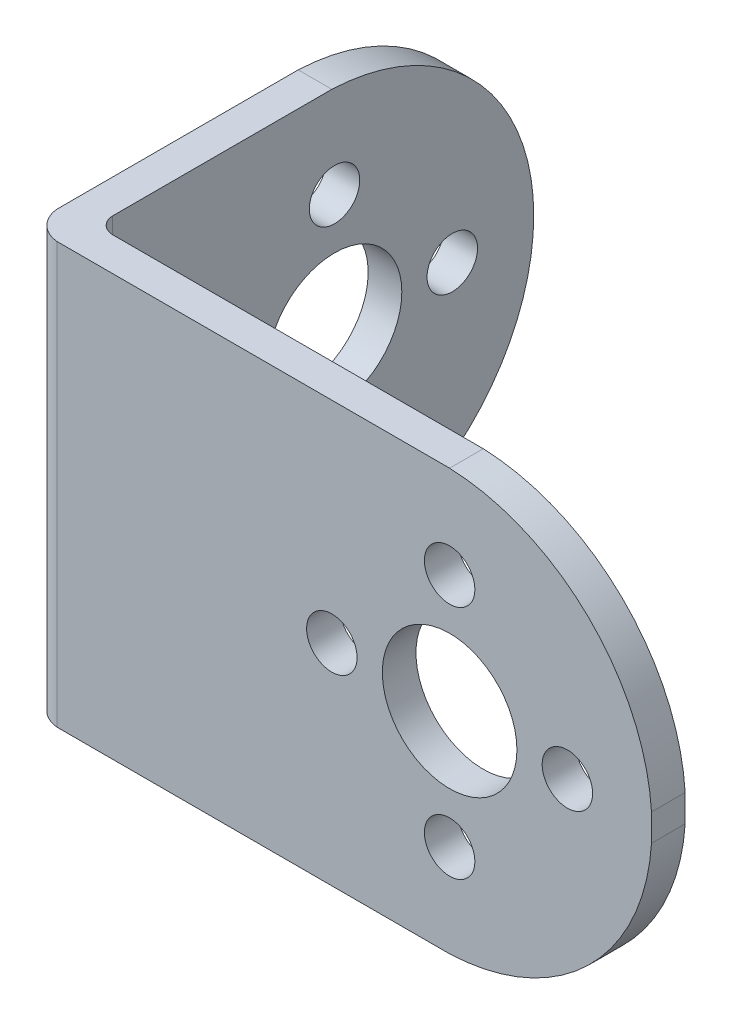
ISO-10303-21;
HEADER;
FILE_DESCRIPTION(('STEP AP214'),'2;1');
FILE_NAME('part.step','',(''),(''),'','','');
FILE_SCHEMA(('AUTOMOTIVE_DESIGN { 1 0 10303 214 1 1 1 1 }'));
ENDSEC;
DATA;
#1=APPLICATION_CONTEXT('core data for automotive mechanical design processes');
#2=APPLICATION_PROTOCOL_DEFINITION('international standard','automotive_design',2000,#1);
#3=PRODUCT_CONTEXT('',#1,'mechanical');
#4=PRODUCT('Part','Part','',(#3));
#5=PRODUCT_RELATED_PRODUCT_CATEGORY('part','',(#4));
#6=PRODUCT_DEFINITION_FORMATION('','',#4);
#7=PRODUCT_DEFINITION_CONTEXT('part definition',#1,'design');
#8=PRODUCT_DEFINITION('design','',#6,#7);
#9=PRODUCT_DEFINITION_SHAPE('','',#8);
#10=(LENGTH_UNIT() NAMED_UNIT(*) SI_UNIT(.MILLI.,.METRE.));
#11=(NAMED_UNIT(*) PLANE_ANGLE_UNIT() SI_UNIT($,.RADIAN.));
#12=(NAMED_UNIT(*) SI_UNIT($,.STERADIAN.) SOLID_ANGLE_UNIT());
#13=UNCERTAINTY_MEASURE_WITH_UNIT(LENGTH_MEASURE(1.E-05),#10,'distance_accuracy_value','');
#14=(GEOMETRIC_REPRESENTATION_CONTEXT(3) GLOBAL_UNCERTAINTY_ASSIGNED_CONTEXT((#13)) GLOBAL_UNIT_ASSIGNED_CONTEXT((#10,
#11,#12)) REPRESENTATION_CONTEXT('',''));
#15=CARTESIAN_POINT('',(0.,0.,0.));
#16=DIRECTION('',(0.,0.,1.));
#17=DIRECTION('',(1.,0.,0.));
#18=AXIS2_PLACEMENT_3D('',#15,#16,#17);
#19=CARTESIAN_POINT('',(0.,25.,0.));
#20=DIRECTION('',(0.,0.,-1.));
#21=DIRECTION('',(-1.,0.,0.));
#22=AXIS2_PLACEMENT_3D('',#19,#20,#21);
#23=PLANE('',#22);
#24=CARTESIAN_POINT('',(25.,19.5,0.));
#25=DIRECTION('',(0.,0.,1.));
#26=DIRECTION('',(1.,0.,0.));
#27=AXIS2_PLACEMENT_3D('',#24,#25,#26);
#28=CIRCLE('',#27,1.5);
#29=CARTESIAN_POINT('',(26.5,19.5,0.));
#30=VERTEX_POINT('',#29);
#31=EDGE_CURVE('E356',#30,#30,#28,.T.);
#32=ORIENTED_EDGE('',*,*,#31,.F.);
#33=EDGE_LOOP('',(#32));
#34=FACE_BOUND('',#33,.T.);
#35=CARTESIAN_POINT('',(32.0000000000001,12.5000000000001,0.));
#36=DIRECTION('',(0.,0.,1.));
#37=DIRECTION('',(1.,0.,0.));
#38=AXIS2_PLACEMENT_3D('',#35,#36,#37);
#39=CIRCLE('',#38,1.5);
#40=CARTESIAN_POINT('',(33.5000000000001,12.5000000000001,0.));
#41=VERTEX_POINT('',#40);
#42=EDGE_CURVE('E352',#41,#41,#39,.T.);
#43=ORIENTED_EDGE('',*,*,#42,.F.);
#44=EDGE_LOOP('',(#43));
#45=FACE_BOUND('',#44,.T.);
#46=CARTESIAN_POINT('',(25.0000000000002,5.5,0.));
#47=DIRECTION('',(0.,0.,1.));
#48=DIRECTION('',(1.,0.,0.));
#49=AXIS2_PLACEMENT_3D('',#46,#47,#48);
#50=CIRCLE('',#49,1.5);
#51=CARTESIAN_POINT('',(26.5000000000002,5.5,0.));
#52=VERTEX_POINT('',#51);
#53=EDGE_CURVE('E348',#52,#52,#50,.T.);
#54=ORIENTED_EDGE('',*,*,#53,.F.);
#55=EDGE_LOOP('',(#54));
#56=FACE_BOUND('',#55,.T.);
#57=CARTESIAN_POINT('',(18.0000000000001,12.5,0.));
#58=DIRECTION('',(0.,0.,1.));
#59=DIRECTION('',(1.,0.,0.));
#60=AXIS2_PLACEMENT_3D('',#57,#58,#59);
#61=CIRCLE('',#60,1.5);
#62=CARTESIAN_POINT('',(19.5000000000001,12.5,0.));
#63=VERTEX_POINT('',#62);
#64=EDGE_CURVE('E347',#63,#63,#61,.T.);
#65=ORIENTED_EDGE('',*,*,#64,.F.);
#66=EDGE_LOOP('',(#65));
#67=FACE_BOUND('',#66,.T.);
#68=CARTESIAN_POINT('',(25.,12.5,0.));
#69=DIRECTION('',(0.,0.,1.));
#70=DIRECTION('',(1.,0.,0.));
#71=AXIS2_PLACEMENT_3D('',#68,#69,#70);
#72=CIRCLE('',#71,4.);
#73=CARTESIAN_POINT('',(29.,12.5,0.));
#74=VERTEX_POINT('',#73);
#75=EDGE_CURVE('E176',#74,#74,#72,.T.);
#76=ORIENTED_EDGE('',*,*,#75,.F.);
#77=EDGE_LOOP('',(#76));
#78=FACE_BOUND('',#77,.T.);
#79=CARTESIAN_POINT('',(24.5166193979498,12.5,0.));
#80=DIRECTION('',(0.,0.,1.));
#81=DIRECTION('',(1.,0.,0.));
#82=AXIS2_PLACEMENT_3D('',#79,#80,#81);
#83=CIRCLE('',#82,12.5093427807554);
#84=CARTESIAN_POINT('',(37.,13.3055219120512,0.));
#85=VERTEX_POINT('',#84);
#86=CARTESIAN_POINT('',(25.,25.,0.));
#87=VERTEX_POINT('',#86);
#88=EDGE_CURVE('E121',#85,#87,#83,.T.);
#89=ORIENTED_EDGE('',*,*,#88,.T.);
#90=DIRECTION('',(1.,0.,0.));
#91=VECTOR('',#90,1.);
#92=CARTESIAN_POINT('',(0.,25.,0.));
#93=LINE('',#92,#91);
#94=CARTESIAN_POINT('',(1.65907540690337,25.,0.));
#95=VERTEX_POINT('',#94);
#96=EDGE_CURVE('E223',#95,#87,#93,.T.);
#97=ORIENTED_EDGE('',*,*,#96,.F.);
#98=DIRECTION('',(0.,-1.,0.));
#99=VECTOR('',#98,1.);
#100=CARTESIAN_POINT('',(1.65907540690337,25.,0.));
#101=LINE('',#100,#99);
#102=CARTESIAN_POINT('',(1.65907540690337,0.,0.));
#103=VERTEX_POINT('',#102);
#104=EDGE_CURVE('E145',#95,#103,#101,.T.);
#105=ORIENTED_EDGE('',*,*,#104,.T.);
#106=DIRECTION('',(1.,0.,0.));
#107=VECTOR('',#106,1.);
#108=CARTESIAN_POINT('',(0.,0.,0.));
#109=LINE('',#108,#107);
#110=CARTESIAN_POINT('',(25.,0.,0.));
#111=VERTEX_POINT('',#110);
#112=EDGE_CURVE('E242',#103,#111,#109,.T.);
#113=ORIENTED_EDGE('',*,*,#112,.T.);
#114=CARTESIAN_POINT('',(24.5166193979498,12.5,0.));
#115=DIRECTION('',(0.,0.,1.));
#116=DIRECTION('',(1.,0.,0.));
#117=AXIS2_PLACEMENT_3D('',#114,#115,#116);
#118=CIRCLE('',#117,12.5093427807554);
#119=CARTESIAN_POINT('',(37.,11.6944780879488,0.));
#120=VERTEX_POINT('',#119);
#121=EDGE_CURVE('E69',#111,#120,#118,.T.);
#122=ORIENTED_EDGE('',*,*,#121,.T.);
#123=DIRECTION('',(0.,-1.,0.));
#124=VECTOR('',#123,1.);
#125=CARTESIAN_POINT('',(37.,25.,0.));
#126=LINE('',#125,#124);
#127=EDGE_CURVE('E137',#85,#120,#126,.T.);
#128=ORIENTED_EDGE('',*,*,#127,.F.);
#129=EDGE_LOOP('',(#89,#97,#105,#113,#122,#128));
#130=FACE_BOUND('',#129,.T.);
#131=ADVANCED_FACE('F44',(#34,#45,#56,#67,#78,#130),#23,.F.);
#132=CARTESIAN_POINT('',(37.,25.,0.));
#133=DIRECTION('',(-1.,0.,0.));
#134=DIRECTION('',(0.,0.,1.));
#135=AXIS2_PLACEMENT_3D('',#132,#133,#134);
#136=PLANE('',#135);
#137=DIRECTION('',(0.,0.,1.));
#138=VECTOR('',#137,1.);
#139=CARTESIAN_POINT('',(37.,13.3055219120512,-25.));
#140=LINE('',#139,#138);
#141=CARTESIAN_POINT('',(37.,13.3055219120512,-2.));
#142=VERTEX_POINT('',#141);
#143=EDGE_CURVE('E124',#142,#85,#140,.T.);
#144=ORIENTED_EDGE('',*,*,#143,.T.);
#145=ORIENTED_EDGE('',*,*,#127,.T.);
#146=DIRECTION('',(0.,0.,1.));
#147=VECTOR('',#146,1.);
#148=CARTESIAN_POINT('',(37.,11.6944780879488,-25.));
#149=LINE('',#148,#147);
#150=CARTESIAN_POINT('',(37.,11.6944780879488,-2.));
#151=VERTEX_POINT('',#150);
#152=EDGE_CURVE('E130',#151,#120,#149,.T.);
#153=ORIENTED_EDGE('',*,*,#152,.F.);
#154=DIRECTION('',(0.,-1.,0.));
#155=VECTOR('',#154,1.);
#156=CARTESIAN_POINT('',(37.,25.,-2.));
#157=LINE('',#156,#155);
#158=EDGE_CURVE('E139',#142,#151,#157,.T.);
#159=ORIENTED_EDGE('',*,*,#158,.F.);
#160=EDGE_LOOP('',(#144,#145,#153,#159));
#161=FACE_BOUND('',#160,.T.);
#162=ADVANCED_FACE('F135',(#161),#136,.F.);
#163=CARTESIAN_POINT('',(0.,25.,-2.));
#164=DIRECTION('',(0.,0.,1.));
#165=DIRECTION('',(1.,0.,0.));
#166=AXIS2_PLACEMENT_3D('',#163,#164,#165);
#167=PLANE('',#166);
#168=CARTESIAN_POINT('',(25.,19.5,-2.));
#169=DIRECTION('',(0.,0.,1.));
#170=DIRECTION('',(1.,0.,0.));
#171=AXIS2_PLACEMENT_3D('',#168,#169,#170);
#172=CIRCLE('',#171,1.5);
#173=CARTESIAN_POINT('',(26.5,19.5,-2.));
#174=VERTEX_POINT('',#173);
#175=EDGE_CURVE('E48',#174,#174,#172,.T.);
#176=ORIENTED_EDGE('',*,*,#175,.T.);
#177=EDGE_LOOP('',(#176));
#178=FACE_BOUND('',#177,.T.);
#179=CARTESIAN_POINT('',(32.0000000000001,12.5000000000001,-2.));
#180=DIRECTION('',(0.,0.,1.));
#181=DIRECTION('',(1.,0.,0.));
#182=AXIS2_PLACEMENT_3D('',#179,#180,#181);
#183=CIRCLE('',#182,1.5);
#184=CARTESIAN_POINT('',(33.5000000000001,12.5000000000001,-2.));
#185=VERTEX_POINT('',#184);
#186=EDGE_CURVE('E183',#185,#185,#183,.T.);
#187=ORIENTED_EDGE('',*,*,#186,.T.);
#188=EDGE_LOOP('',(#187));
#189=FACE_BOUND('',#188,.T.);
#190=CARTESIAN_POINT('',(25.0000000000002,5.5,-2.));
#191=DIRECTION('',(0.,0.,1.));
#192=DIRECTION('',(1.,0.,0.));
#193=AXIS2_PLACEMENT_3D('',#190,#191,#192);
#194=CIRCLE('',#193,1.5);
#195=CARTESIAN_POINT('',(26.5000000000002,5.5,-2.));
#196=VERTEX_POINT('',#195);
#197=EDGE_CURVE('E180',#196,#196,#194,.T.);
#198=ORIENTED_EDGE('',*,*,#197,.T.);
#199=EDGE_LOOP('',(#198));
#200=FACE_BOUND('',#199,.T.);
#201=CARTESIAN_POINT('',(18.0000000000001,12.5,-2.));
#202=DIRECTION('',(0.,0.,1.));
#203=DIRECTION('',(1.,0.,0.));
#204=AXIS2_PLACEMENT_3D('',#201,#202,#203);
#205=CIRCLE('',#204,1.5);
#206=CARTESIAN_POINT('',(19.5000000000001,12.5,-2.));
#207=VERTEX_POINT('',#206);
#208=EDGE_CURVE('E175',#207,#207,#205,.T.);
#209=ORIENTED_EDGE('',*,*,#208,.T.);
#210=EDGE_LOOP('',(#209));
#211=FACE_BOUND('',#210,.T.);
#212=CARTESIAN_POINT('',(25.,12.5,-2.));
#213=DIRECTION('',(0.,0.,1.));
#214=DIRECTION('',(1.,0.,0.));
#215=AXIS2_PLACEMENT_3D('',#212,#213,#214);
#216=CIRCLE('',#215,4.);
#217=CARTESIAN_POINT('',(29.,12.5,-2.));
#218=VERTEX_POINT('',#217);
#219=EDGE_CURVE('E171',#218,#218,#216,.T.);
#220=ORIENTED_EDGE('',*,*,#219,.T.);
#221=EDGE_LOOP('',(#220));
#222=FACE_BOUND('',#221,.T.);
#223=CARTESIAN_POINT('',(24.5166193979498,12.5,-2.));
#224=DIRECTION('',(0.,0.,1.));
#225=DIRECTION('',(1.,0.,0.));
#226=AXIS2_PLACEMENT_3D('',#223,#224,#225);
#227=CIRCLE('',#226,12.5093427807554);
#228=CARTESIAN_POINT('',(25.,25.,-2.));
#229=VERTEX_POINT('',#228);
#230=EDGE_CURVE('E62',#142,#229,#227,.T.);
#231=ORIENTED_EDGE('',*,*,#230,.F.);
#232=ORIENTED_EDGE('',*,*,#158,.T.);
#233=CARTESIAN_POINT('',(24.5166193979498,12.5,-2.));
#234=DIRECTION('',(0.,0.,1.));
#235=DIRECTION('',(1.,0.,0.));
#236=AXIS2_PLACEMENT_3D('',#233,#234,#235);
#237=CIRCLE('',#236,12.5093427807554);
#238=CARTESIAN_POINT('',(25.,0.,-2.));
#239=VERTEX_POINT('',#238);
#240=EDGE_CURVE('E141',#239,#151,#237,.T.);
#241=ORIENTED_EDGE('',*,*,#240,.F.);
#242=DIRECTION('',(-1.,0.,0.));
#243=VECTOR('',#242,1.);
#244=CARTESIAN_POINT('',(0.,0.,-2.));
#245=LINE('',#244,#243);
#246=CARTESIAN_POINT('',(3.03872971417256,0.,-2.));
#247=VERTEX_POINT('',#246);
#248=EDGE_CURVE('E213',#239,#247,#245,.T.);
#249=ORIENTED_EDGE('',*,*,#248,.T.);
#250=DIRECTION('',(0.,-1.,0.));
#251=VECTOR('',#250,1.);
#252=CARTESIAN_POINT('',(3.03872971417256,25.,-2.));
#253=LINE('',#252,#251);
#254=CARTESIAN_POINT('',(3.03872971417256,25.,-2.));
#255=VERTEX_POINT('',#254);
#256=EDGE_CURVE('E152',#255,#247,#253,.T.);
#257=ORIENTED_EDGE('',*,*,#256,.F.);
#258=DIRECTION('',(-1.,0.,0.));
#259=VECTOR('',#258,1.);
#260=CARTESIAN_POINT('',(0.,25.,-2.));
#261=LINE('',#260,#259);
#262=EDGE_CURVE('E226',#229,#255,#261,.T.);
#263=ORIENTED_EDGE('',*,*,#262,.F.);
#264=EDGE_LOOP('',(#231,#232,#241,#249,#257,#263));
#265=FACE_BOUND('',#264,.T.);
#266=ADVANCED_FACE('F267',(#178,#189,#200,#211,#222,#265),#167,.F.);
#267=CARTESIAN_POINT('',(0.,25.,0.));
#268=DIRECTION('',(0.,1.,0.));
#269=DIRECTION('',(0.,0.,1.));
#270=AXIS2_PLACEMENT_3D('',#267,#268,#269);
#271=PLANE('',#270);
#272=ORIENTED_EDGE('',*,*,#96,.T.);
#273=DIRECTION('',(0.,0.,1.));
#274=VECTOR('',#273,1.);
#275=CARTESIAN_POINT('',(25.,25.,-25.));
#276=LINE('',#275,#274);
#277=EDGE_CURVE('E12',#87,#229,#276,.F.);
#278=ORIENTED_EDGE('',*,*,#277,.T.);
#279=ORIENTED_EDGE('',*,*,#262,.T.);
#280=CARTESIAN_POINT('',(3.00314791089518,25.,-3.00314791089518));
#281=DIRECTION('',(0.,1.,0.));
#282=DIRECTION('',(0.,0.,1.));
#283=AXIS2_PLACEMENT_3D('',#280,#281,#282);
#284=CIRCLE('',#283,1.00377875842132);
#285=CARTESIAN_POINT('',(2.,25.,-2.9675661076178));
#286=VERTEX_POINT('',#285);
#287=EDGE_CURVE('E208',#286,#255,#284,.T.);
#288=ORIENTED_EDGE('',*,*,#287,.F.);
#289=DIRECTION('',(0.,0.,1.));
#290=VECTOR('',#289,1.);
#291=CARTESIAN_POINT('',(2.,25.,0.));
#292=LINE('',#291,#290);
#293=CARTESIAN_POINT('',(2.,25.,-16.));
#294=VERTEX_POINT('',#293);
#295=EDGE_CURVE('E212',#294,#286,#292,.T.);
#296=ORIENTED_EDGE('',*,*,#295,.F.);
#297=DIRECTION('',(-1.,0.,0.));
#298=VECTOR('',#297,1.);
#299=CARTESIAN_POINT('',(25.,25.,-16.));
#300=LINE('',#299,#298);
#301=CARTESIAN_POINT('',(0.,25.,-16.));
#302=VERTEX_POINT('',#301);
#303=EDGE_CURVE('E162',#302,#294,#300,.F.);
#304=ORIENTED_EDGE('',*,*,#303,.F.);
#305=DIRECTION('',(0.,0.,-1.));
#306=VECTOR('',#305,1.);
#307=CARTESIAN_POINT('',(0.,25.,0.));
#308=LINE('',#307,#306);
#309=CARTESIAN_POINT('',(0.,25.,-1.65907540690337));
#310=VERTEX_POINT('',#309);
#311=EDGE_CURVE('E216',#310,#302,#308,.T.);
#312=ORIENTED_EDGE('',*,*,#311,.F.);
#313=CARTESIAN_POINT('',(1.82953770345169,25.,-1.82953770345169));
#314=DIRECTION('',(0.,1.,0.));
#315=DIRECTION('',(0.,0.,1.));
#316=AXIS2_PLACEMENT_3D('',#313,#314,#315);
#317=CIRCLE('',#316,1.83746172828056);
#318=EDGE_CURVE('E220',#310,#95,#317,.T.);
#319=ORIENTED_EDGE('',*,*,#318,.T.);
#320=EDGE_LOOP('',(#272,#278,#279,#288,#296,#304,#312,#319));
#321=FACE_BOUND('',#320,.T.);
#322=ADVANCED_FACE('F265',(#321),#271,.T.);
#323=CARTESIAN_POINT('',(0.,0.,0.));
#324=DIRECTION('',(0.,1.,0.));
#325=DIRECTION('',(0.,0.,1.));
#326=AXIS2_PLACEMENT_3D('',#323,#324,#325);
#327=PLANE('',#326);
#328=DIRECTION('',(0.,0.,1.));
#329=VECTOR('',#328,1.);
#330=CARTESIAN_POINT('',(25.,0.,-25.));
#331=LINE('',#330,#329);
#332=EDGE_CURVE('E54',#111,#239,#331,.F.);
#333=ORIENTED_EDGE('',*,*,#332,.F.);
#334=ORIENTED_EDGE('',*,*,#112,.F.);
#335=CARTESIAN_POINT('',(1.82953770345169,0.,-1.82953770345169));
#336=DIRECTION('',(0.,1.,0.));
#337=DIRECTION('',(0.,0.,1.));
#338=AXIS2_PLACEMENT_3D('',#335,#336,#337);
#339=CIRCLE('',#338,1.83746172828056);
#340=CARTESIAN_POINT('',(0.,0.,-1.65907540690337));
#341=VERTEX_POINT('',#340);
#342=EDGE_CURVE('E239',#341,#103,#339,.T.);
#343=ORIENTED_EDGE('',*,*,#342,.F.);
#344=DIRECTION('',(0.,0.,-1.));
#345=VECTOR('',#344,1.);
#346=CARTESIAN_POINT('',(0.,0.,0.));
#347=LINE('',#346,#345);
#348=CARTESIAN_POINT('',(0.,0.,-16.));
#349=VERTEX_POINT('',#348);
#350=EDGE_CURVE('E235',#341,#349,#347,.T.);
#351=ORIENTED_EDGE('',*,*,#350,.T.);
#352=DIRECTION('',(-1.,0.,0.));
#353=VECTOR('',#352,1.);
#354=CARTESIAN_POINT('',(25.,0.,-16.));
#355=LINE('',#354,#353);
#356=CARTESIAN_POINT('',(2.,0.,-16.));
#357=VERTEX_POINT('',#356);
#358=EDGE_CURVE('E165',#349,#357,#355,.F.);
#359=ORIENTED_EDGE('',*,*,#358,.T.);
#360=DIRECTION('',(0.,0.,1.));
#361=VECTOR('',#360,1.);
#362=CARTESIAN_POINT('',(2.,0.,0.));
#363=LINE('',#362,#361);
#364=CARTESIAN_POINT('',(2.,0.,-2.9675661076178));
#365=VERTEX_POINT('',#364);
#366=EDGE_CURVE('E232',#357,#365,#363,.T.);
#367=ORIENTED_EDGE('',*,*,#366,.T.);
#368=CARTESIAN_POINT('',(3.00314791089518,0.,-3.00314791089518));
#369=DIRECTION('',(0.,1.,0.));
#370=DIRECTION('',(0.,0.,1.));
#371=AXIS2_PLACEMENT_3D('',#368,#369,#370);
#372=CIRCLE('',#371,1.00377875842132);
#373=EDGE_CURVE('E207',#365,#247,#372,.T.);
#374=ORIENTED_EDGE('',*,*,#373,.T.);
#375=ORIENTED_EDGE('',*,*,#248,.F.);
#376=EDGE_LOOP('',(#333,#334,#343,#351,#359,#367,#374,#375));
#377=FACE_BOUND('',#376,.T.);
#378=ADVANCED_FACE('F257',(#377),#327,.F.);
#379=CARTESIAN_POINT('',(2.,25.,0.));
#380=DIRECTION('',(1.,0.,0.));
#381=DIRECTION('',(0.,0.,-1.));
#382=AXIS2_PLACEMENT_3D('',#379,#380,#381);
#383=PLANE('',#382);
#384=CARTESIAN_POINT('',(2.,19.5,-16.1590754069034));
#385=DIRECTION('',(1.,0.,0.));
#386=DIRECTION('',(0.,0.,-1.));
#387=AXIS2_PLACEMENT_3D('',#384,#385,#386);
#388=CIRCLE('',#387,1.5);
#389=CARTESIAN_POINT('',(2.,19.5,-17.6590754069034));
#390=VERTEX_POINT('',#389);
#391=EDGE_CURVE('E313',#390,#390,#388,.T.);
#392=ORIENTED_EDGE('',*,*,#391,.F.);
#393=EDGE_LOOP('',(#392));
#394=FACE_BOUND('',#393,.T.);
#395=CARTESIAN_POINT('',(2.,12.5000000000001,-9.1590754069033));
#396=DIRECTION('',(1.,0.,0.));
#397=DIRECTION('',(0.,0.,-1.));
#398=AXIS2_PLACEMENT_3D('',#395,#396,#397);
#399=CIRCLE('',#398,1.5);
#400=CARTESIAN_POINT('',(2.,12.5000000000001,-10.6590754069033));
#401=VERTEX_POINT('',#400);
#402=EDGE_CURVE('E317',#401,#401,#399,.T.);
#403=ORIENTED_EDGE('',*,*,#402,.F.);
#404=EDGE_LOOP('',(#403));
#405=FACE_BOUND('',#404,.T.);
#406=CARTESIAN_POINT('',(2.,5.5,-16.1590754069032));
#407=DIRECTION('',(1.,0.,0.));
#408=DIRECTION('',(0.,0.,-1.));
#409=AXIS2_PLACEMENT_3D('',#406,#407,#408);
#410=CIRCLE('',#409,1.5);
#411=CARTESIAN_POINT('',(2.,5.5,-17.6590754069032));
#412=VERTEX_POINT('',#411);
#413=EDGE_CURVE('E321',#412,#412,#410,.T.);
#414=ORIENTED_EDGE('',*,*,#413,.F.);
#415=EDGE_LOOP('',(#414));
#416=FACE_BOUND('',#415,.T.);
#417=CARTESIAN_POINT('',(2.,12.4999999999999,-23.1590754069033));
#418=DIRECTION('',(1.,0.,0.));
#419=DIRECTION('',(0.,0.,-1.));
#420=AXIS2_PLACEMENT_3D('',#417,#418,#419);
#421=CIRCLE('',#420,1.5);
#422=CARTESIAN_POINT('',(2.,12.4999999999999,-24.6590754069033));
#423=VERTEX_POINT('',#422);
#424=EDGE_CURVE('E325',#423,#423,#421,.T.);
#425=ORIENTED_EDGE('',*,*,#424,.F.);
#426=EDGE_LOOP('',(#425));
#427=FACE_BOUND('',#426,.T.);
#428=CARTESIAN_POINT('',(2.,12.5,-16.1590754069034));
#429=DIRECTION('',(1.,0.,0.));
#430=DIRECTION('',(0.,0.,-1.));
#431=AXIS2_PLACEMENT_3D('',#428,#429,#430);
#432=CIRCLE('',#431,4.);
#433=CARTESIAN_POINT('',(2.,12.5,-20.1590754069034));
#434=VERTEX_POINT('',#433);
#435=EDGE_CURVE('E328',#434,#434,#432,.T.);
#436=ORIENTED_EDGE('',*,*,#435,.F.);
#437=EDGE_LOOP('',(#436));
#438=FACE_BOUND('',#437,.T.);
#439=ORIENTED_EDGE('',*,*,#366,.F.);
#440=CARTESIAN_POINT('',(2.,12.5,-15.4895833333333));
#441=DIRECTION('',(1.,0.,0.));
#442=DIRECTION('',(0.,0.,-1.));
#443=AXIS2_PLACEMENT_3D('',#440,#441,#442);
#444=CIRCLE('',#443,12.5104166666667);
#445=EDGE_CURVE('E204',#294,#357,#444,.F.);
#446=ORIENTED_EDGE('',*,*,#445,.F.);
#447=ORIENTED_EDGE('',*,*,#295,.T.);
#448=DIRECTION('',(0.,-1.,0.));
#449=VECTOR('',#448,1.);
#450=CARTESIAN_POINT('',(2.,25.,-2.9675661076178));
#451=LINE('',#450,#449);
#452=EDGE_CURVE('E158',#286,#365,#451,.T.);
#453=ORIENTED_EDGE('',*,*,#452,.T.);
#454=EDGE_LOOP('',(#439,#446,#447,#453));
#455=FACE_BOUND('',#454,.T.);
#456=ADVANCED_FACE('F262',(#394,#405,#416,#427,#438,#455),#383,.T.);
#457=CARTESIAN_POINT('',(0.,25.,0.));
#458=DIRECTION('',(-1.,0.,0.));
#459=DIRECTION('',(0.,0.,1.));
#460=AXIS2_PLACEMENT_3D('',#457,#458,#459);
#461=PLANE('',#460);
#462=CARTESIAN_POINT('',(0.,19.5,-16.1590754069034));
#463=DIRECTION('',(-1.,0.,0.));
#464=DIRECTION('',(0.,0.,1.));
#465=AXIS2_PLACEMENT_3D('',#462,#463,#464);
#466=CIRCLE('',#465,1.5);
#467=CARTESIAN_POINT('',(0.,19.5,-14.6590754069034));
#468=VERTEX_POINT('',#467);
#469=EDGE_CURVE('E337',#468,#468,#466,.T.);
#470=ORIENTED_EDGE('',*,*,#469,.F.);
#471=EDGE_LOOP('',(#470));
#472=FACE_BOUND('',#471,.T.);
#473=CARTESIAN_POINT('',(0.,12.5000000000001,-9.1590754069033));
#474=DIRECTION('',(-1.,0.,0.));
#475=DIRECTION('',(0.,0.,1.));
#476=AXIS2_PLACEMENT_3D('',#473,#474,#475);
#477=CIRCLE('',#476,1.5);
#478=CARTESIAN_POINT('',(0.,12.5000000000001,-7.6590754069033));
#479=VERTEX_POINT('',#478);
#480=EDGE_CURVE('E505',#479,#479,#477,.T.);
#481=ORIENTED_EDGE('',*,*,#480,.F.);
#482=EDGE_LOOP('',(#481));
#483=FACE_BOUND('',#482,.T.);
#484=CARTESIAN_POINT('',(0.,5.5,-16.1590754069032));
#485=DIRECTION('',(-1.,0.,0.));
#486=DIRECTION('',(0.,0.,1.));
#487=AXIS2_PLACEMENT_3D('',#484,#485,#486);
#488=CIRCLE('',#487,1.5);
#489=CARTESIAN_POINT('',(0.,5.5,-14.6590754069032));
#490=VERTEX_POINT('',#489);
#491=EDGE_CURVE('E509',#490,#490,#488,.T.);
#492=ORIENTED_EDGE('',*,*,#491,.F.);
#493=EDGE_LOOP('',(#492));
#494=FACE_BOUND('',#493,.T.);
#495=CARTESIAN_POINT('',(0.,12.4999999999999,-23.1590754069033));
#496=DIRECTION('',(-1.,0.,0.));
#497=DIRECTION('',(0.,0.,1.));
#498=AXIS2_PLACEMENT_3D('',#495,#496,#497);
#499=CIRCLE('',#498,1.5);
#500=CARTESIAN_POINT('',(0.,12.4999999999999,-21.6590754069033));
#501=VERTEX_POINT('',#500);
#502=EDGE_CURVE('E511',#501,#501,#499,.T.);
#503=ORIENTED_EDGE('',*,*,#502,.F.);
#504=EDGE_LOOP('',(#503));
#505=FACE_BOUND('',#504,.T.);
#506=CARTESIAN_POINT('',(0.,12.5,-16.1590754069034));
#507=DIRECTION('',(-1.,0.,0.));
#508=DIRECTION('',(0.,0.,1.));
#509=AXIS2_PLACEMENT_3D('',#506,#507,#508);
#510=CIRCLE('',#509,4.);
#511=CARTESIAN_POINT('',(0.,12.5,-12.1590754069034));
#512=VERTEX_POINT('',#511);
#513=EDGE_CURVE('E331',#512,#512,#510,.T.);
#514=ORIENTED_EDGE('',*,*,#513,.F.);
#515=EDGE_LOOP('',(#514));
#516=FACE_BOUND('',#515,.T.);
#517=CARTESIAN_POINT('',(0.,12.5,-15.4895833333333));
#518=DIRECTION('',(-1.,0.,0.));
#519=DIRECTION('',(0.,0.,1.));
#520=AXIS2_PLACEMENT_3D('',#517,#518,#519);
#521=CIRCLE('',#520,12.5104166666667);
#522=EDGE_CURVE('E201',#349,#302,#521,.F.);
#523=ORIENTED_EDGE('',*,*,#522,.F.);
#524=ORIENTED_EDGE('',*,*,#350,.F.);
#525=DIRECTION('',(0.,-1.,0.));
#526=VECTOR('',#525,1.);
#527=CARTESIAN_POINT('',(0.,25.,-1.65907540690337));
#528=LINE('',#527,#526);
#529=EDGE_CURVE('E150',#310,#341,#528,.T.);
#530=ORIENTED_EDGE('',*,*,#529,.F.);
#531=ORIENTED_EDGE('',*,*,#311,.T.);
#532=EDGE_LOOP('',(#523,#524,#530,#531));
#533=FACE_BOUND('',#532,.T.);
#534=ADVANCED_FACE('F279',(#472,#483,#494,#505,#516,#533),#461,.T.);
#535=CARTESIAN_POINT('',(3.00314791089518,25.,-3.00314791089518));
#536=DIRECTION('',(0.,-1.,0.));
#537=DIRECTION('',(0.,0.,-1.));
#538=AXIS2_PLACEMENT_3D('',#535,#536,#537);
#539=CYLINDRICAL_SURFACE('',#538,1.00377875842132);
#540=ORIENTED_EDGE('',*,*,#373,.F.);
#541=ORIENTED_EDGE('',*,*,#452,.F.);
#542=ORIENTED_EDGE('',*,*,#287,.T.);
#543=ORIENTED_EDGE('',*,*,#256,.T.);
#544=EDGE_LOOP('',(#540,#541,#542,#543));
#545=FACE_BOUND('',#544,.T.);
#546=ADVANCED_FACE('F46',(#545),#539,.F.);
#547=CARTESIAN_POINT('',(1.82953770345169,25.,-1.82953770345169));
#548=DIRECTION('',(0.,-1.,0.));
#549=DIRECTION('',(0.,0.,-1.));
#550=AXIS2_PLACEMENT_3D('',#547,#548,#549);
#551=CYLINDRICAL_SURFACE('',#550,1.83746172828056);
#552=ORIENTED_EDGE('',*,*,#342,.T.);
#553=ORIENTED_EDGE('',*,*,#104,.F.);
#554=ORIENTED_EDGE('',*,*,#318,.F.);
#555=ORIENTED_EDGE('',*,*,#529,.T.);
#556=EDGE_LOOP('',(#552,#553,#554,#555));
#557=FACE_BOUND('',#556,.T.);
#558=ADVANCED_FACE('F275',(#557),#551,.T.);
#559=CARTESIAN_POINT('',(25.,12.5,-15.4895833333333));
#560=DIRECTION('',(-1.,0.,0.));
#561=DIRECTION('',(0.,0.,1.));
#562=AXIS2_PLACEMENT_3D('',#559,#560,#561);
#563=CYLINDRICAL_SURFACE('',#562,12.5104166666667);
#564=ORIENTED_EDGE('',*,*,#445,.T.);
#565=ORIENTED_EDGE('',*,*,#358,.F.);
#566=ORIENTED_EDGE('',*,*,#522,.T.);
#567=ORIENTED_EDGE('',*,*,#303,.T.);
#568=EDGE_LOOP('',(#564,#565,#566,#567));
#569=FACE_BOUND('',#568,.T.);
#570=ADVANCED_FACE('F281',(#569),#563,.T.);
#571=CARTESIAN_POINT('',(24.5166193979498,12.5,-25.));
#572=DIRECTION('',(0.,0.,1.));
#573=DIRECTION('',(1.,0.,0.));
#574=AXIS2_PLACEMENT_3D('',#571,#572,#573);
#575=CYLINDRICAL_SURFACE('',#574,12.5093427807554);
#576=ORIENTED_EDGE('',*,*,#240,.T.);
#577=ORIENTED_EDGE('',*,*,#152,.T.);
#578=ORIENTED_EDGE('',*,*,#121,.F.);
#579=ORIENTED_EDGE('',*,*,#332,.T.);
#580=EDGE_LOOP('',(#576,#577,#578,#579));
#581=FACE_BOUND('',#580,.T.);
#582=ADVANCED_FACE('F269',(#581),#575,.T.);
#583=CARTESIAN_POINT('',(24.5166193979498,12.5,-25.));
#584=DIRECTION('',(0.,0.,1.));
#585=DIRECTION('',(1.,0.,0.));
#586=AXIS2_PLACEMENT_3D('',#583,#584,#585);
#587=CYLINDRICAL_SURFACE('',#586,12.5093427807554);
#588=ORIENTED_EDGE('',*,*,#230,.T.);
#589=ORIENTED_EDGE('',*,*,#277,.F.);
#590=ORIENTED_EDGE('',*,*,#88,.F.);
#591=ORIENTED_EDGE('',*,*,#143,.F.);
#592=EDGE_LOOP('',(#588,#589,#590,#591));
#593=FACE_BOUND('',#592,.T.);
#594=ADVANCED_FACE('F123',(#593),#587,.T.);
#595=CARTESIAN_POINT('',(25.,12.5,-25.));
#596=DIRECTION('',(0.,0.,1.));
#597=DIRECTION('',(1.,0.,0.));
#598=AXIS2_PLACEMENT_3D('',#595,#596,#597);
#599=CYLINDRICAL_SURFACE('',#598,4.);
#600=ORIENTED_EDGE('',*,*,#75,.T.);
#601=EDGE_LOOP('',(#600));
#602=FACE_BOUND('',#601,.T.);
#603=ORIENTED_EDGE('',*,*,#219,.F.);
#604=EDGE_LOOP('',(#603));
#605=FACE_BOUND('',#604,.T.);
#606=ADVANCED_FACE('F367',(#602,#605),#599,.F.);
#607=CARTESIAN_POINT('',(18.0000000000001,12.5,-25.));
#608=DIRECTION('',(0.,0.,1.));
#609=DIRECTION('',(1.,0.,0.));
#610=AXIS2_PLACEMENT_3D('',#607,#608,#609);
#611=CYLINDRICAL_SURFACE('',#610,1.5);
#612=ORIENTED_EDGE('',*,*,#64,.T.);
#613=EDGE_LOOP('',(#612));
#614=FACE_BOUND('',#613,.T.);
#615=ORIENTED_EDGE('',*,*,#208,.F.);
#616=EDGE_LOOP('',(#615));
#617=FACE_BOUND('',#616,.T.);
#618=ADVANCED_FACE('F371',(#614,#617),#611,.F.);
#619=CARTESIAN_POINT('',(25.0000000000002,5.5,-25.));
#620=DIRECTION('',(0.,0.,1.));
#621=DIRECTION('',(1.,0.,0.));
#622=AXIS2_PLACEMENT_3D('',#619,#620,#621);
#623=CYLINDRICAL_SURFACE('',#622,1.5);
#624=ORIENTED_EDGE('',*,*,#53,.T.);
#625=EDGE_LOOP('',(#624));
#626=FACE_BOUND('',#625,.T.);
#627=ORIENTED_EDGE('',*,*,#197,.F.);
#628=EDGE_LOOP('',(#627));
#629=FACE_BOUND('',#628,.T.);
#630=ADVANCED_FACE('F385',(#626,#629),#623,.F.);
#631=CARTESIAN_POINT('',(32.0000000000001,12.5000000000001,-25.));
#632=DIRECTION('',(0.,0.,1.));
#633=DIRECTION('',(1.,0.,0.));
#634=AXIS2_PLACEMENT_3D('',#631,#632,#633);
#635=CYLINDRICAL_SURFACE('',#634,1.5);
#636=ORIENTED_EDGE('',*,*,#42,.T.);
#637=EDGE_LOOP('',(#636));
#638=FACE_BOUND('',#637,.T.);
#639=ORIENTED_EDGE('',*,*,#186,.F.);
#640=EDGE_LOOP('',(#639));
#641=FACE_BOUND('',#640,.T.);
#642=ADVANCED_FACE('F391',(#638,#641),#635,.F.);
#643=CARTESIAN_POINT('',(25.,19.5,-25.));
#644=DIRECTION('',(0.,0.,1.));
#645=DIRECTION('',(1.,0.,0.));
#646=AXIS2_PLACEMENT_3D('',#643,#644,#645);
#647=CYLINDRICAL_SURFACE('',#646,1.5);
#648=ORIENTED_EDGE('',*,*,#31,.T.);
#649=EDGE_LOOP('',(#648));
#650=FACE_BOUND('',#649,.T.);
#651=ORIENTED_EDGE('',*,*,#175,.F.);
#652=EDGE_LOOP('',(#651));
#653=FACE_BOUND('',#652,.T.);
#654=ADVANCED_FACE('F396',(#650,#653),#647,.F.);
#655=CARTESIAN_POINT('',(25.,12.5,-16.1590754069034));
#656=DIRECTION('',(-1.,0.,0.));
#657=DIRECTION('',(0.,0.,1.));
#658=AXIS2_PLACEMENT_3D('',#655,#656,#657);
#659=CYLINDRICAL_SURFACE('',#658,4.);
#660=ORIENTED_EDGE('',*,*,#435,.T.);
#661=EDGE_LOOP('',(#660));
#662=FACE_BOUND('',#661,.T.);
#663=ORIENTED_EDGE('',*,*,#513,.T.);
#664=EDGE_LOOP('',(#663));
#665=FACE_BOUND('',#664,.T.);
#666=ADVANCED_FACE('F399',(#662,#665),#659,.F.);
#667=CARTESIAN_POINT('',(25.,12.4999999999999,-23.1590754069033));
#668=DIRECTION('',(-1.,0.,0.));
#669=DIRECTION('',(0.,0.,1.));
#670=AXIS2_PLACEMENT_3D('',#667,#668,#669);
#671=CYLINDRICAL_SURFACE('',#670,1.5);
#672=ORIENTED_EDGE('',*,*,#424,.T.);
#673=EDGE_LOOP('',(#672));
#674=FACE_BOUND('',#673,.T.);
#675=ORIENTED_EDGE('',*,*,#502,.T.);
#676=EDGE_LOOP('',(#675));
#677=FACE_BOUND('',#676,.T.);
#678=ADVANCED_FACE('F459',(#674,#677),#671,.F.);
#679=CARTESIAN_POINT('',(25.,5.5,-16.1590754069032));
#680=DIRECTION('',(-1.,0.,0.));
#681=DIRECTION('',(0.,0.,1.));
#682=AXIS2_PLACEMENT_3D('',#679,#680,#681);
#683=CYLINDRICAL_SURFACE('',#682,1.5);
#684=ORIENTED_EDGE('',*,*,#413,.T.);
#685=EDGE_LOOP('',(#684));
#686=FACE_BOUND('',#685,.T.);
#687=ORIENTED_EDGE('',*,*,#491,.T.);
#688=EDGE_LOOP('',(#687));
#689=FACE_BOUND('',#688,.T.);
#690=ADVANCED_FACE('F467',(#686,#689),#683,.F.);
#691=CARTESIAN_POINT('',(25.,12.5000000000001,-9.1590754069033));
#692=DIRECTION('',(-1.,0.,0.));
#693=DIRECTION('',(0.,0.,1.));
#694=AXIS2_PLACEMENT_3D('',#691,#692,#693);
#695=CYLINDRICAL_SURFACE('',#694,1.5);
#696=ORIENTED_EDGE('',*,*,#402,.T.);
#697=EDGE_LOOP('',(#696));
#698=FACE_BOUND('',#697,.T.);
#699=ORIENTED_EDGE('',*,*,#480,.T.);
#700=EDGE_LOOP('',(#699));
#701=FACE_BOUND('',#700,.T.);
#702=ADVANCED_FACE('F477',(#698,#701),#695,.F.);
#703=CARTESIAN_POINT('',(25.,19.5,-16.1590754069034));
#704=DIRECTION('',(-1.,0.,0.));
#705=DIRECTION('',(0.,0.,1.));
#706=AXIS2_PLACEMENT_3D('',#703,#704,#705);
#707=CYLINDRICAL_SURFACE('',#706,1.5);
#708=ORIENTED_EDGE('',*,*,#391,.T.);
#709=EDGE_LOOP('',(#708));
#710=FACE_BOUND('',#709,.T.);
#711=ORIENTED_EDGE('',*,*,#469,.T.);
#712=EDGE_LOOP('',(#711));
#713=FACE_BOUND('',#712,.T.);
#714=ADVANCED_FACE('F487',(#710,#713),#707,.F.);
#715=CLOSED_SHELL('',(#131,#162,#266,#322,#378,#456,#534,#546,#558,#570,#582,#594,#606,#618,
#630,#642,#654,#666,#678,#690,#702,#714));
#716=MANIFOLD_SOLID_BREP('B2',#715);
#717=ADVANCED_BREP_SHAPE_REPRESENTATION('',(#18,#716),#14);
#718=SHAPE_DEFINITION_REPRESENTATION(#9,#717);
ENDSEC;
END-ISO-10303-21;
